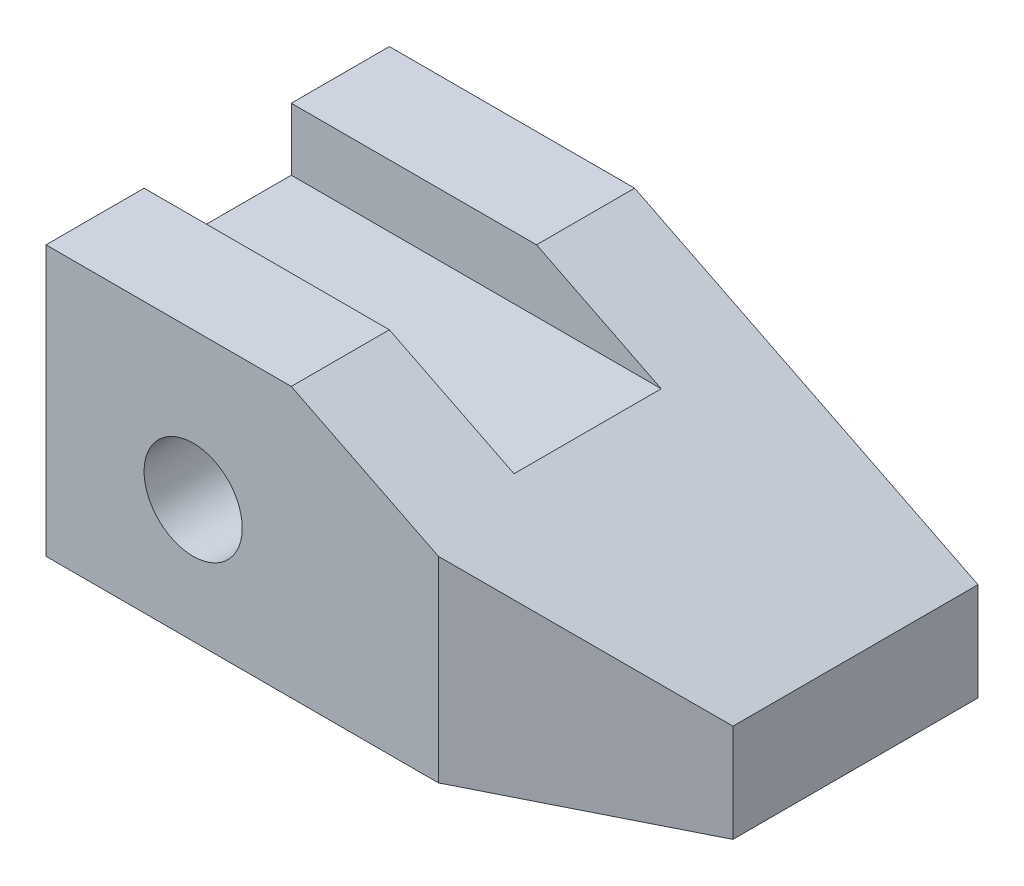
ISO-10303-21;
HEADER;
FILE_DESCRIPTION(('STEP AP214'),'2;1');
FILE_NAME('part.step','',(''),(''),'','','');
FILE_SCHEMA(('AUTOMOTIVE_DESIGN { 1 0 10303 214 1 1 1 1 }'));
ENDSEC;
DATA;
#1=APPLICATION_CONTEXT('core data for automotive mechanical design processes');
#2=APPLICATION_PROTOCOL_DEFINITION('international standard','automotive_design',2000,#1);
#3=PRODUCT_CONTEXT('',#1,'mechanical');
#4=PRODUCT('Part','Part','',(#3));
#5=PRODUCT_RELATED_PRODUCT_CATEGORY('part','',(#4));
#6=PRODUCT_DEFINITION_FORMATION('','',#4);
#7=PRODUCT_DEFINITION_CONTEXT('part definition',#1,'design');
#8=PRODUCT_DEFINITION('design','',#6,#7);
#9=PRODUCT_DEFINITION_SHAPE('','',#8);
#10=(LENGTH_UNIT() NAMED_UNIT(*) SI_UNIT(.MILLI.,.METRE.));
#11=(NAMED_UNIT(*) PLANE_ANGLE_UNIT() SI_UNIT($,.RADIAN.));
#12=(NAMED_UNIT(*) SI_UNIT($,.STERADIAN.) SOLID_ANGLE_UNIT());
#13=UNCERTAINTY_MEASURE_WITH_UNIT(LENGTH_MEASURE(1.E-05),#10,'distance_accuracy_value','');
#14=(GEOMETRIC_REPRESENTATION_CONTEXT(3) GLOBAL_UNCERTAINTY_ASSIGNED_CONTEXT((#13)) GLOBAL_UNIT_ASSIGNED_CONTEXT((#10,
#11,#12)) REPRESENTATION_CONTEXT('',''));
#15=CARTESIAN_POINT('',(0.,0.,0.));
#16=DIRECTION('',(0.,0.,1.));
#17=DIRECTION('',(1.,0.,0.));
#18=AXIS2_PLACEMENT_3D('',#15,#16,#17);
#19=CARTESIAN_POINT('',(-125.52,116.77,88.9));
#20=DIRECTION('',(0.,-1.,0.));
#21=DIRECTION('',(0.,0.,-1.));
#22=AXIS2_PLACEMENT_3D('',#19,#20,#21);
#23=PLANE('',#22);
#24=DIRECTION('',(0.,0.,-1.));
#25=VECTOR('',#24,1.);
#26=CARTESIAN_POINT('',(-125.52,116.77,88.9));
#27=LINE('',#26,#25);
#28=CARTESIAN_POINT('',(-125.52,116.77,25.4));
#29=VERTEX_POINT('',#28);
#30=CARTESIAN_POINT('',(-125.52,116.77,0.));
#31=VERTEX_POINT('',#30);
#32=EDGE_CURVE('E166',#29,#31,#27,.T.);
#33=ORIENTED_EDGE('',*,*,#32,.F.);
#34=DIRECTION('',(1.,0.,0.));
#35=VECTOR('',#34,1.);
#36=CARTESIAN_POINT('',(-125.52,116.77,25.4));
#37=LINE('',#36,#35);
#38=CARTESIAN_POINT('',(-62.02,116.77,25.4));
#39=VERTEX_POINT('',#38);
#40=EDGE_CURVE('E45',#29,#39,#37,.T.);
#41=ORIENTED_EDGE('',*,*,#40,.T.);
#42=DIRECTION('',(0.,0.,-1.));
#43=VECTOR('',#42,1.);
#44=CARTESIAN_POINT('',(-62.02,116.77,88.9));
#45=LINE('',#44,#43);
#46=CARTESIAN_POINT('',(-62.02,116.77,0.));
#47=VERTEX_POINT('',#46);
#48=EDGE_CURVE('E182',#39,#47,#45,.T.);
#49=ORIENTED_EDGE('',*,*,#48,.T.);
#50=DIRECTION('',(-1.,0.,0.));
#51=VECTOR('',#50,1.);
#52=CARTESIAN_POINT('',(-125.52,116.77,0.));
#53=LINE('',#52,#51);
#54=EDGE_CURVE('E159',#47,#31,#53,.T.);
#55=ORIENTED_EDGE('',*,*,#54,.T.);
#56=EDGE_LOOP('',(#33,#41,#49,#55));
#57=FACE_BOUND('',#56,.T.);
#58=ADVANCED_FACE('F37',(#57),#23,.F.);
#59=CARTESIAN_POINT('',(0.,0.,88.9));
#60=DIRECTION('',(0.,0.,-1.));
#61=DIRECTION('',(-1.,0.,0.));
#62=AXIS2_PLACEMENT_3D('',#59,#60,#61);
#63=PLANE('',#62);
#64=DIRECTION('',(1.,0.,0.));
#65=VECTOR('',#64,1.);
#66=CARTESIAN_POINT('',(-125.52,46.92,88.9));
#67=LINE('',#66,#65);
#68=CARTESIAN_POINT('',(-125.52,46.92,88.9));
#69=VERTEX_POINT('',#68);
#70=CARTESIAN_POINT('',(-23.92,46.92,88.9));
#71=VERTEX_POINT('',#70);
#72=EDGE_CURVE('E158',#69,#71,#67,.T.);
#73=ORIENTED_EDGE('',*,*,#72,.T.);
#74=DIRECTION('',(0.,1.,0.));
#75=VECTOR('',#74,1.);
#76=CARTESIAN_POINT('',(-23.92,46.92,88.9));
#77=LINE('',#76,#75);
#78=CARTESIAN_POINT('',(-23.92,97.72,88.9));
#79=VERTEX_POINT('',#78);
#80=EDGE_CURVE('E144',#71,#79,#77,.T.);
#81=ORIENTED_EDGE('',*,*,#80,.T.);
#82=DIRECTION('',(-0.894427190999916,0.447213595499958,0.));
#83=VECTOR('',#82,1.);
#84=CARTESIAN_POINT('',(-62.02,116.77,88.9));
#85=LINE('',#84,#83);
#86=CARTESIAN_POINT('',(-62.02,116.77,88.9));
#87=VERTEX_POINT('',#86);
#88=EDGE_CURVE('E162',#79,#87,#85,.T.);
#89=ORIENTED_EDGE('',*,*,#88,.T.);
#90=DIRECTION('',(-1.,0.,0.));
#91=VECTOR('',#90,1.);
#92=CARTESIAN_POINT('',(-125.52,116.77,88.9));
#93=LINE('',#92,#91);
#94=CARTESIAN_POINT('',(-125.52,116.77,88.9));
#95=VERTEX_POINT('',#94);
#96=EDGE_CURVE('E164',#87,#95,#93,.T.);
#97=ORIENTED_EDGE('',*,*,#96,.T.);
#98=DIRECTION('',(0.,-1.,0.));
#99=VECTOR('',#98,1.);
#100=CARTESIAN_POINT('',(-125.52,46.92,88.9));
#101=LINE('',#100,#99);
#102=EDGE_CURVE('E155',#95,#69,#101,.T.);
#103=ORIENTED_EDGE('',*,*,#102,.T.);
#104=EDGE_LOOP('',(#73,#81,#89,#97,#103));
#105=FACE_BOUND('',#104,.T.);
#106=CARTESIAN_POINT('',(-87.42,78.67,88.9));
#107=DIRECTION('',(0.,0.,1.));
#108=DIRECTION('',(1.,0.,0.));
#109=AXIS2_PLACEMENT_3D('',#106,#107,#108);
#110=CIRCLE('',#109,12.7);
#111=CARTESIAN_POINT('',(-74.72,78.67,88.9));
#112=VERTEX_POINT('',#111);
#113=EDGE_CURVE('E149',#112,#112,#110,.T.);
#114=ORIENTED_EDGE('',*,*,#113,.F.);
#115=EDGE_LOOP('',(#114));
#116=FACE_BOUND('',#115,.T.);
#117=ADVANCED_FACE('F214',(#105,#116),#63,.F.);
#118=CARTESIAN_POINT('',(0.,0.,0.));
#119=DIRECTION('',(0.,0.,-1.));
#120=DIRECTION('',(-1.,0.,0.));
#121=AXIS2_PLACEMENT_3D('',#118,#119,#120);
#122=PLANE('',#121);
#123=DIRECTION('',(0.,-1.,0.));
#124=VECTOR('',#123,1.);
#125=CARTESIAN_POINT('',(-125.52,46.92,0.));
#126=LINE('',#125,#124);
#127=CARTESIAN_POINT('',(-125.52,46.92,0.));
#128=VERTEX_POINT('',#127);
#129=EDGE_CURVE('E152',#31,#128,#126,.T.);
#130=ORIENTED_EDGE('',*,*,#129,.F.);
#131=ORIENTED_EDGE('',*,*,#54,.F.);
#132=DIRECTION('',(-0.894427190999916,0.447213595499958,0.));
#133=VECTOR('',#132,1.);
#134=CARTESIAN_POINT('',(-62.02,116.77,0.));
#135=LINE('',#134,#133);
#136=CARTESIAN_POINT('',(26.88,72.32,0.));
#137=VERTEX_POINT('',#136);
#138=EDGE_CURVE('E175',#137,#47,#135,.T.);
#139=ORIENTED_EDGE('',*,*,#138,.F.);
#140=DIRECTION('',(0.,1.,0.));
#141=VECTOR('',#140,1.);
#142=CARTESIAN_POINT('',(26.88,46.92,0.));
#143=LINE('',#142,#141);
#144=CARTESIAN_POINT('',(26.88,46.92,0.));
#145=VERTEX_POINT('',#144);
#146=EDGE_CURVE('E172',#145,#137,#143,.T.);
#147=ORIENTED_EDGE('',*,*,#146,.F.);
#148=DIRECTION('',(1.,0.,0.));
#149=VECTOR('',#148,1.);
#150=CARTESIAN_POINT('',(-125.52,46.92,0.));
#151=LINE('',#150,#149);
#152=EDGE_CURVE('E169',#128,#145,#151,.T.);
#153=ORIENTED_EDGE('',*,*,#152,.F.);
#154=EDGE_LOOP('',(#130,#131,#139,#147,#153));
#155=FACE_BOUND('',#154,.T.);
#156=CARTESIAN_POINT('',(-87.42,78.67,0.));
#157=DIRECTION('',(0.,0.,1.));
#158=DIRECTION('',(1.,0.,0.));
#159=AXIS2_PLACEMENT_3D('',#156,#157,#158);
#160=CIRCLE('',#159,12.7);
#161=CARTESIAN_POINT('',(-74.72,78.67,0.));
#162=VERTEX_POINT('',#161);
#163=EDGE_CURVE('E147',#162,#162,#160,.T.);
#164=ORIENTED_EDGE('',*,*,#163,.T.);
#165=EDGE_LOOP('',(#164));
#166=FACE_BOUND('',#165,.T.);
#167=ADVANCED_FACE('F206',(#155,#166),#122,.T.);
#168=CARTESIAN_POINT('',(-125.52,46.92,88.9));
#169=DIRECTION('',(1.,0.,0.));
#170=DIRECTION('',(0.,0.,-1.));
#171=AXIS2_PLACEMENT_3D('',#168,#169,#170);
#172=PLANE('',#171);
#173=DIRECTION('',(0.,0.,1.));
#174=VECTOR('',#173,1.);
#175=CARTESIAN_POINT('',(-125.52,100.63139819079,25.4));
#176=LINE('',#175,#174);
#177=CARTESIAN_POINT('',(-125.52,100.63139819079,25.4));
#178=VERTEX_POINT('',#177);
#179=CARTESIAN_POINT('',(-125.52,100.63139819079,63.5));
#180=VERTEX_POINT('',#179);
#181=EDGE_CURVE('E119',#178,#180,#176,.T.);
#182=ORIENTED_EDGE('',*,*,#181,.F.);
#183=DIRECTION('',(0.,-1.,0.));
#184=VECTOR('',#183,1.);
#185=CARTESIAN_POINT('',(-125.52,116.77,25.4));
#186=LINE('',#185,#184);
#187=EDGE_CURVE('E125',#29,#178,#186,.T.);
#188=ORIENTED_EDGE('',*,*,#187,.F.);
#189=ORIENTED_EDGE('',*,*,#32,.T.);
#190=ORIENTED_EDGE('',*,*,#129,.T.);
#191=DIRECTION('',(0.,0.,-1.));
#192=VECTOR('',#191,1.);
#193=CARTESIAN_POINT('',(-125.52,46.92,88.9));
#194=LINE('',#193,#192);
#195=EDGE_CURVE('E190',#69,#128,#194,.T.);
#196=ORIENTED_EDGE('',*,*,#195,.F.);
#197=ORIENTED_EDGE('',*,*,#102,.F.);
#198=CARTESIAN_POINT('',(-125.52,116.77,63.5));
#199=VERTEX_POINT('',#198);
#200=EDGE_CURVE('E180',#95,#199,#27,.T.);
#201=ORIENTED_EDGE('',*,*,#200,.T.);
#202=DIRECTION('',(0.,1.,0.));
#203=VECTOR('',#202,1.);
#204=CARTESIAN_POINT('',(-125.52,116.77,63.5));
#205=LINE('',#204,#203);
#206=EDGE_CURVE('E52',#180,#199,#205,.T.);
#207=ORIENTED_EDGE('',*,*,#206,.F.);
#208=EDGE_LOOP('',(#182,#188,#189,#190,#196,#197,#201,#207));
#209=FACE_BOUND('',#208,.T.);
#210=ADVANCED_FACE('F39',(#209),#172,.F.);
#211=CARTESIAN_POINT('',(-125.52,46.92,88.9));
#212=DIRECTION('',(0.,1.,0.));
#213=DIRECTION('',(0.,0.,1.));
#214=AXIS2_PLACEMENT_3D('',#211,#212,#213);
#215=PLANE('',#214);
#216=DIRECTION('',(0.,0.,-1.));
#217=VECTOR('',#216,1.);
#218=CARTESIAN_POINT('',(26.88,46.92,88.9));
#219=LINE('',#218,#217);
#220=CARTESIAN_POINT('',(26.88,46.92,63.4514302244516));
#221=VERTEX_POINT('',#220);
#222=EDGE_CURVE('E188',#221,#145,#219,.T.);
#223=ORIENTED_EDGE('',*,*,#222,.F.);
#224=DIRECTION('',(-0.894084996431995,0.,0.447897331042728));
#225=VECTOR('',#224,1.);
#226=CARTESIAN_POINT('',(26.88,46.92,63.4514302244516));
#227=LINE('',#226,#225);
#228=EDGE_CURVE('E141',#221,#71,#227,.T.);
#229=ORIENTED_EDGE('',*,*,#228,.T.);
#230=ORIENTED_EDGE('',*,*,#72,.F.);
#231=ORIENTED_EDGE('',*,*,#195,.T.);
#232=ORIENTED_EDGE('',*,*,#152,.T.);
#233=EDGE_LOOP('',(#223,#229,#230,#231,#232));
#234=FACE_BOUND('',#233,.T.);
#235=ADVANCED_FACE('F212',(#234),#215,.F.);
#236=CARTESIAN_POINT('',(26.88,46.92,88.9));
#237=DIRECTION('',(-1.,0.,0.));
#238=DIRECTION('',(0.,-1.,0.));
#239=AXIS2_PLACEMENT_3D('',#236,#237,#238);
#240=PLANE('',#239);
#241=DIRECTION('',(0.,0.,-1.));
#242=VECTOR('',#241,1.);
#243=CARTESIAN_POINT('',(26.88,72.32,88.9));
#244=LINE('',#243,#242);
#245=CARTESIAN_POINT('',(26.88,72.32,63.4514302244516));
#246=VERTEX_POINT('',#245);
#247=EDGE_CURVE('E186',#246,#137,#244,.T.);
#248=ORIENTED_EDGE('',*,*,#247,.F.);
#249=DIRECTION('',(0.,1.,0.));
#250=VECTOR('',#249,1.);
#251=CARTESIAN_POINT('',(26.88,46.92,63.4514302244516));
#252=LINE('',#251,#250);
#253=EDGE_CURVE('E60',#221,#246,#252,.T.);
#254=ORIENTED_EDGE('',*,*,#253,.F.);
#255=ORIENTED_EDGE('',*,*,#222,.T.);
#256=ORIENTED_EDGE('',*,*,#146,.T.);
#257=EDGE_LOOP('',(#248,#254,#255,#256));
#258=FACE_BOUND('',#257,.T.);
#259=ADVANCED_FACE('F224',(#258),#240,.F.);
#260=CARTESIAN_POINT('',(-62.02,116.77,88.9));
#261=DIRECTION('',(-0.447213595499958,-0.894427190999916,0.));
#262=DIRECTION('',(0.894427190999916,-0.447213595499958,0.));
#263=AXIS2_PLACEMENT_3D('',#260,#261,#262);
#264=PLANE('',#263);
#265=ORIENTED_EDGE('',*,*,#48,.F.);
#266=DIRECTION('',(0.894427190999916,-0.447213595499958,0.));
#267=VECTOR('',#266,1.);
#268=CARTESIAN_POINT('',(-62.02,116.77,25.4));
#269=LINE('',#268,#267);
#270=CARTESIAN_POINT('',(-29.7427963815796,100.63139819079,25.4));
#271=VERTEX_POINT('',#270);
#272=EDGE_CURVE('E139',#39,#271,#269,.T.);
#273=ORIENTED_EDGE('',*,*,#272,.T.);
#274=DIRECTION('',(0.,0.,1.));
#275=VECTOR('',#274,1.);
#276=CARTESIAN_POINT('',(-29.7427963815796,100.63139819079,88.9));
#277=LINE('',#276,#275);
#278=CARTESIAN_POINT('',(-29.7427963815796,100.63139819079,63.5));
#279=VERTEX_POINT('',#278);
#280=EDGE_CURVE('E11',#271,#279,#277,.T.);
#281=ORIENTED_EDGE('',*,*,#280,.T.);
#282=DIRECTION('',(-0.894427190999916,0.447213595499958,0.));
#283=VECTOR('',#282,1.);
#284=CARTESIAN_POINT('',(-62.02,116.77,63.5));
#285=LINE('',#284,#283);
#286=CARTESIAN_POINT('',(-62.02,116.77,63.5));
#287=VERTEX_POINT('',#286);
#288=EDGE_CURVE('E135',#279,#287,#285,.T.);
#289=ORIENTED_EDGE('',*,*,#288,.T.);
#290=EDGE_CURVE('E183',#87,#287,#45,.T.);
#291=ORIENTED_EDGE('',*,*,#290,.F.);
#292=ORIENTED_EDGE('',*,*,#88,.F.);
#293=DIRECTION('',(0.816236239802327,-0.408118119901164,-0.408898521691748));
#294=VECTOR('',#293,1.);
#295=CARTESIAN_POINT('',(-55.6497561603113,113.584878080156,104.79521483478));
#296=LINE('',#295,#294);
#297=EDGE_CURVE('E193',#79,#246,#296,.T.);
#298=ORIENTED_EDGE('',*,*,#297,.T.);
#299=ORIENTED_EDGE('',*,*,#247,.T.);
#300=ORIENTED_EDGE('',*,*,#138,.T.);
#301=EDGE_LOOP('',(#265,#273,#281,#289,#291,#292,#298,#299,#300));
#302=FACE_BOUND('',#301,.T.);
#303=ADVANCED_FACE('F199',(#302),#264,.F.);
#304=ORIENTED_EDGE('',*,*,#290,.T.);
#305=DIRECTION('',(-1.,0.,0.));
#306=VECTOR('',#305,1.);
#307=CARTESIAN_POINT('',(-125.52,116.77,63.5));
#308=LINE('',#307,#306);
#309=EDGE_CURVE('E195',#287,#199,#308,.T.);
#310=ORIENTED_EDGE('',*,*,#309,.T.);
#311=ORIENTED_EDGE('',*,*,#200,.F.);
#312=ORIENTED_EDGE('',*,*,#96,.F.);
#313=EDGE_LOOP('',(#304,#310,#311,#312));
#314=FACE_BOUND('',#313,.T.);
#315=ADVANCED_FACE('F221',(#314),#23,.F.);
#316=CARTESIAN_POINT('',(-87.42,78.67,88.9));
#317=DIRECTION('',(0.,0.,-1.));
#318=DIRECTION('',(-1.,0.,0.));
#319=AXIS2_PLACEMENT_3D('',#316,#317,#318);
#320=CYLINDRICAL_SURFACE('',#319,12.7);
#321=ORIENTED_EDGE('',*,*,#113,.T.);
#322=EDGE_LOOP('',(#321));
#323=FACE_BOUND('',#322,.T.);
#324=ORIENTED_EDGE('',*,*,#163,.F.);
#325=EDGE_LOOP('',(#324));
#326=FACE_BOUND('',#325,.T.);
#327=ADVANCED_FACE('F240',(#323,#326),#320,.F.);
#328=CARTESIAN_POINT('',(26.88,46.92,63.4514302244516));
#329=DIRECTION('',(-0.447897331042728,0.,-0.894084996431995));
#330=DIRECTION('',(-0.894084996431995,0.,0.447897331042728));
#331=AXIS2_PLACEMENT_3D('',#328,#329,#330);
#332=PLANE('',#331);
#333=ORIENTED_EDGE('',*,*,#80,.F.);
#334=ORIENTED_EDGE('',*,*,#228,.F.);
#335=ORIENTED_EDGE('',*,*,#253,.T.);
#336=ORIENTED_EDGE('',*,*,#297,.F.);
#337=EDGE_LOOP('',(#333,#334,#335,#336));
#338=FACE_BOUND('',#337,.T.);
#339=ADVANCED_FACE('F244',(#338),#332,.F.);
#340=CARTESIAN_POINT('',(128.48,100.63139819079,25.4));
#341=DIRECTION('',(0.,-1.,0.));
#342=DIRECTION('',(0.,0.,-1.));
#343=AXIS2_PLACEMENT_3D('',#340,#341,#342);
#344=PLANE('',#343);
#345=DIRECTION('',(-1.,0.,0.));
#346=VECTOR('',#345,1.);
#347=CARTESIAN_POINT('',(128.48,100.63139819079,25.4));
#348=LINE('',#347,#346);
#349=EDGE_CURVE('E114',#271,#178,#348,.T.);
#350=ORIENTED_EDGE('',*,*,#349,.T.);
#351=ORIENTED_EDGE('',*,*,#181,.T.);
#352=DIRECTION('',(-1.,0.,0.));
#353=VECTOR('',#352,1.);
#354=CARTESIAN_POINT('',(128.48,100.63139819079,63.5));
#355=LINE('',#354,#353);
#356=EDGE_CURVE('E122',#279,#180,#355,.T.);
#357=ORIENTED_EDGE('',*,*,#356,.F.);
#358=ORIENTED_EDGE('',*,*,#280,.F.);
#359=EDGE_LOOP('',(#350,#351,#357,#358));
#360=FACE_BOUND('',#359,.T.);
#361=ADVANCED_FACE('F116',(#360),#344,.F.);
#362=CARTESIAN_POINT('',(128.48,116.77,25.4));
#363=DIRECTION('',(0.,0.,-1.));
#364=DIRECTION('',(-1.,0.,0.));
#365=AXIS2_PLACEMENT_3D('',#362,#363,#364);
#366=PLANE('',#365);
#367=ORIENTED_EDGE('',*,*,#40,.F.);
#368=ORIENTED_EDGE('',*,*,#187,.T.);
#369=ORIENTED_EDGE('',*,*,#349,.F.);
#370=ORIENTED_EDGE('',*,*,#272,.F.);
#371=EDGE_LOOP('',(#367,#368,#369,#370));
#372=FACE_BOUND('',#371,.T.);
#373=ADVANCED_FACE('F126',(#372),#366,.F.);
#374=CARTESIAN_POINT('',(128.48,116.77,63.5));
#375=DIRECTION('',(0.,0.,1.));
#376=DIRECTION('',(1.,0.,0.));
#377=AXIS2_PLACEMENT_3D('',#374,#375,#376);
#378=PLANE('',#377);
#379=ORIENTED_EDGE('',*,*,#356,.T.);
#380=ORIENTED_EDGE('',*,*,#206,.T.);
#381=ORIENTED_EDGE('',*,*,#309,.F.);
#382=ORIENTED_EDGE('',*,*,#288,.F.);
#383=EDGE_LOOP('',(#379,#380,#381,#382));
#384=FACE_BOUND('',#383,.T.);
#385=ADVANCED_FACE('F222',(#384),#378,.F.);
#386=CLOSED_SHELL('',(#58,#117,#167,#210,#235,#259,#303,#315,#327,#339,#361,#373,#385));
#387=MANIFOLD_SOLID_BREP('B2',#386);
#388=ADVANCED_BREP_SHAPE_REPRESENTATION('',(#18,#387),#14);
#389=SHAPE_DEFINITION_REPRESENTATION(#9,#388);
ENDSEC;
END-ISO-10303-21;
